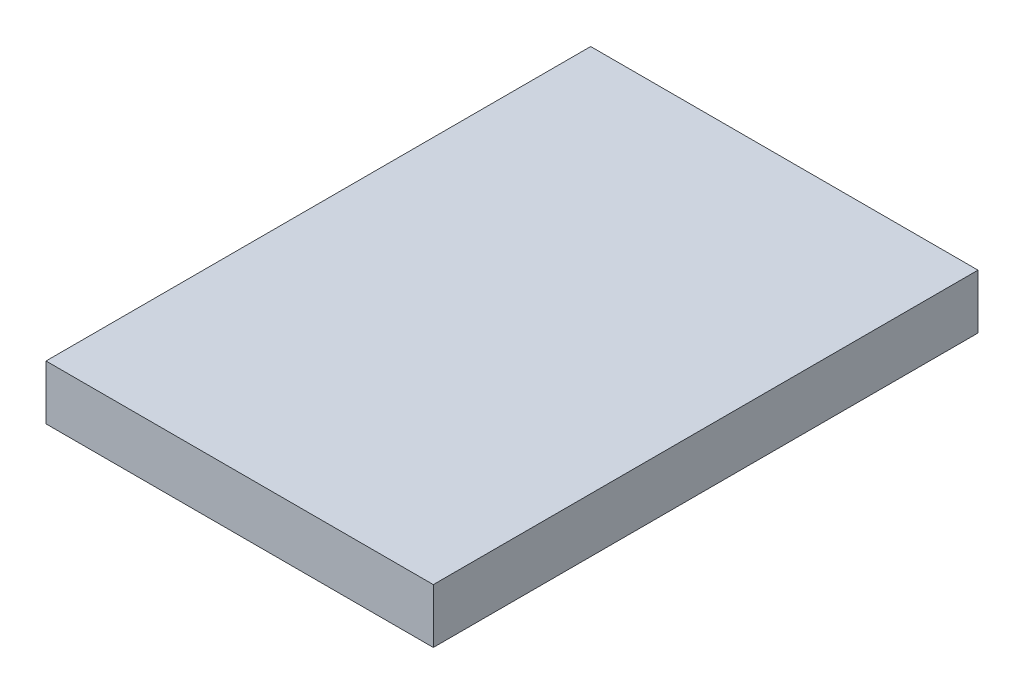
ISO-10303-21;
HEADER;
FILE_DESCRIPTION(('STEP AP214'),'2;1');
FILE_NAME('part.step','',(''),(''),'','','');
FILE_SCHEMA(('AUTOMOTIVE_DESIGN { 1 0 10303 214 1 1 1 1 }'));
ENDSEC;
DATA;
#1=APPLICATION_CONTEXT('core data for automotive mechanical design processes');
#2=APPLICATION_PROTOCOL_DEFINITION('international standard','automotive_design',2000,#1);
#3=PRODUCT_CONTEXT('',#1,'mechanical');
#4=PRODUCT('Part','Part','',(#3));
#5=PRODUCT_RELATED_PRODUCT_CATEGORY('part','',(#4));
#6=PRODUCT_DEFINITION_FORMATION('','',#4);
#7=PRODUCT_DEFINITION_CONTEXT('part definition',#1,'design');
#8=PRODUCT_DEFINITION('design','',#6,#7);
#9=PRODUCT_DEFINITION_SHAPE('','',#8);
#10=(LENGTH_UNIT() NAMED_UNIT(*) SI_UNIT(.MILLI.,.METRE.));
#11=(NAMED_UNIT(*) PLANE_ANGLE_UNIT() SI_UNIT($,.RADIAN.));
#12=(NAMED_UNIT(*) SI_UNIT($,.STERADIAN.) SOLID_ANGLE_UNIT());
#13=UNCERTAINTY_MEASURE_WITH_UNIT(LENGTH_MEASURE(1.E-05),#10,'distance_accuracy_value','');
#14=(GEOMETRIC_REPRESENTATION_CONTEXT(3) GLOBAL_UNCERTAINTY_ASSIGNED_CONTEXT((#13)) GLOBAL_UNIT_ASSIGNED_CONTEXT((#10,
#11,#12)) REPRESENTATION_CONTEXT('',''));
#15=CARTESIAN_POINT('',(0.,0.,0.));
#16=DIRECTION('',(0.,0.,1.));
#17=DIRECTION('',(1.,0.,0.));
#18=AXIS2_PLACEMENT_3D('',#15,#16,#17);
#19=CARTESIAN_POINT('',(3.2,0.45,0.));
#20=DIRECTION('',(0.,0.,-1.));
#21=DIRECTION('',(-1.,0.,0.));
#22=AXIS2_PLACEMENT_3D('',#19,#20,#21);
#23=PLANE('',#22);
#24=DIRECTION('',(1.,0.,0.));
#25=VECTOR('',#24,1.);
#26=CARTESIAN_POINT('',(3.2,0.,0.));
#27=LINE('',#26,#25);
#28=CARTESIAN_POINT('',(0.,0.,0.));
#29=VERTEX_POINT('',#28);
#30=CARTESIAN_POINT('',(3.2,0.,0.));
#31=VERTEX_POINT('',#30);
#32=EDGE_CURVE('E97',#29,#31,#27,.T.);
#33=ORIENTED_EDGE('',*,*,#32,.T.);
#34=DIRECTION('',(0.,-1.,0.));
#35=VECTOR('',#34,1.);
#36=CARTESIAN_POINT('',(3.2,0.45,0.));
#37=LINE('',#36,#35);
#38=CARTESIAN_POINT('',(3.2,0.45,0.));
#39=VERTEX_POINT('',#38);
#40=EDGE_CURVE('E11',#39,#31,#37,.T.);
#41=ORIENTED_EDGE('',*,*,#40,.F.);
#42=DIRECTION('',(1.,0.,0.));
#43=VECTOR('',#42,1.);
#44=CARTESIAN_POINT('',(3.2,0.45,0.));
#45=LINE('',#44,#43);
#46=CARTESIAN_POINT('',(0.,0.45,0.));
#47=VERTEX_POINT('',#46);
#48=EDGE_CURVE('E85',#47,#39,#45,.T.);
#49=ORIENTED_EDGE('',*,*,#48,.F.);
#50=DIRECTION('',(0.,-1.,0.));
#51=VECTOR('',#50,1.);
#52=CARTESIAN_POINT('',(0.,0.45,0.));
#53=LINE('',#52,#51);
#54=EDGE_CURVE('E93',#47,#29,#53,.T.);
#55=ORIENTED_EDGE('',*,*,#54,.T.);
#56=EDGE_LOOP('',(#33,#41,#49,#55));
#57=FACE_BOUND('',#56,.T.);
#58=ADVANCED_FACE('F34',(#57),#23,.F.);
#59=CARTESIAN_POINT('',(3.2,0.45,-4.5));
#60=DIRECTION('',(-1.,0.,0.));
#61=DIRECTION('',(0.,0.,1.));
#62=AXIS2_PLACEMENT_3D('',#59,#60,#61);
#63=PLANE('',#62);
#64=DIRECTION('',(0.,0.,-1.));
#65=VECTOR('',#64,1.);
#66=CARTESIAN_POINT('',(3.2,0.,-4.5));
#67=LINE('',#66,#65);
#68=CARTESIAN_POINT('',(3.2,0.,-4.5));
#69=VERTEX_POINT('',#68);
#70=EDGE_CURVE('E89',#31,#69,#67,.T.);
#71=ORIENTED_EDGE('',*,*,#70,.T.);
#72=DIRECTION('',(0.,-1.,0.));
#73=VECTOR('',#72,1.);
#74=CARTESIAN_POINT('',(3.2,0.45,-4.5));
#75=LINE('',#74,#73);
#76=CARTESIAN_POINT('',(3.2,0.45,-4.5));
#77=VERTEX_POINT('',#76);
#78=EDGE_CURVE('E42',#77,#69,#75,.T.);
#79=ORIENTED_EDGE('',*,*,#78,.F.);
#80=DIRECTION('',(0.,0.,-1.));
#81=VECTOR('',#80,1.);
#82=CARTESIAN_POINT('',(3.2,0.45,-4.5));
#83=LINE('',#82,#81);
#84=EDGE_CURVE('E80',#39,#77,#83,.T.);
#85=ORIENTED_EDGE('',*,*,#84,.F.);
#86=ORIENTED_EDGE('',*,*,#40,.T.);
#87=EDGE_LOOP('',(#71,#79,#85,#86));
#88=FACE_BOUND('',#87,.T.);
#89=ADVANCED_FACE('F88',(#88),#63,.F.);
#90=CARTESIAN_POINT('',(0.,0.45,-4.5));
#91=DIRECTION('',(0.,0.,1.));
#92=DIRECTION('',(1.,0.,0.));
#93=AXIS2_PLACEMENT_3D('',#90,#91,#92);
#94=PLANE('',#93);
#95=DIRECTION('',(-1.,0.,0.));
#96=VECTOR('',#95,1.);
#97=CARTESIAN_POINT('',(0.,0.,-4.5));
#98=LINE('',#97,#96);
#99=CARTESIAN_POINT('',(0.,0.,-4.5));
#100=VERTEX_POINT('',#99);
#101=EDGE_CURVE('E67',#69,#100,#98,.T.);
#102=ORIENTED_EDGE('',*,*,#101,.T.);
#103=DIRECTION('',(0.,-1.,0.));
#104=VECTOR('',#103,1.);
#105=CARTESIAN_POINT('',(0.,0.45,-4.5));
#106=LINE('',#105,#104);
#107=CARTESIAN_POINT('',(0.,0.45,-4.5));
#108=VERTEX_POINT('',#107);
#109=EDGE_CURVE('E90',#108,#100,#106,.T.);
#110=ORIENTED_EDGE('',*,*,#109,.F.);
#111=DIRECTION('',(-1.,0.,0.));
#112=VECTOR('',#111,1.);
#113=CARTESIAN_POINT('',(0.,0.45,-4.5));
#114=LINE('',#113,#112);
#115=EDGE_CURVE('E83',#77,#108,#114,.T.);
#116=ORIENTED_EDGE('',*,*,#115,.F.);
#117=ORIENTED_EDGE('',*,*,#78,.T.);
#118=EDGE_LOOP('',(#102,#110,#116,#117));
#119=FACE_BOUND('',#118,.T.);
#120=ADVANCED_FACE('F91',(#119),#94,.F.);
#121=CARTESIAN_POINT('',(0.,0.45,0.));
#122=DIRECTION('',(1.,0.,0.));
#123=DIRECTION('',(0.,0.,-1.));
#124=AXIS2_PLACEMENT_3D('',#121,#122,#123);
#125=PLANE('',#124);
#126=DIRECTION('',(0.,0.,1.));
#127=VECTOR('',#126,1.);
#128=CARTESIAN_POINT('',(0.,0.,0.));
#129=LINE('',#128,#127);
#130=EDGE_CURVE('E73',#100,#29,#129,.T.);
#131=ORIENTED_EDGE('',*,*,#130,.T.);
#132=ORIENTED_EDGE('',*,*,#54,.F.);
#133=DIRECTION('',(0.,0.,1.));
#134=VECTOR('',#133,1.);
#135=CARTESIAN_POINT('',(0.,0.45,0.));
#136=LINE('',#135,#134);
#137=EDGE_CURVE('E50',#108,#47,#136,.T.);
#138=ORIENTED_EDGE('',*,*,#137,.F.);
#139=ORIENTED_EDGE('',*,*,#109,.T.);
#140=EDGE_LOOP('',(#131,#132,#138,#139));
#141=FACE_BOUND('',#140,.T.);
#142=ADVANCED_FACE('F104',(#141),#125,.F.);
#143=CARTESIAN_POINT('',(0.,0.45,0.));
#144=DIRECTION('',(0.,-1.,0.));
#145=DIRECTION('',(0.,0.,-1.));
#146=AXIS2_PLACEMENT_3D('',#143,#144,#145);
#147=PLANE('',#146);
#148=ORIENTED_EDGE('',*,*,#48,.T.);
#149=ORIENTED_EDGE('',*,*,#84,.T.);
#150=ORIENTED_EDGE('',*,*,#115,.T.);
#151=ORIENTED_EDGE('',*,*,#137,.T.);
#152=EDGE_LOOP('',(#148,#149,#150,#151));
#153=FACE_BOUND('',#152,.T.);
#154=ADVANCED_FACE('F81',(#153),#147,.F.);
#155=CARTESIAN_POINT('',(0.,0.,0.));
#156=DIRECTION('',(0.,-1.,0.));
#157=DIRECTION('',(0.,0.,-1.));
#158=AXIS2_PLACEMENT_3D('',#155,#156,#157);
#159=PLANE('',#158);
#160=ORIENTED_EDGE('',*,*,#32,.F.);
#161=ORIENTED_EDGE('',*,*,#130,.F.);
#162=ORIENTED_EDGE('',*,*,#101,.F.);
#163=ORIENTED_EDGE('',*,*,#70,.F.);
#164=EDGE_LOOP('',(#160,#161,#162,#163));
#165=FACE_BOUND('',#164,.T.);
#166=ADVANCED_FACE('F107',(#165),#159,.T.);
#167=CLOSED_SHELL('',(#58,#89,#120,#142,#154,#166));
#168=MANIFOLD_SOLID_BREP('B2',#167);
#169=ADVANCED_BREP_SHAPE_REPRESENTATION('',(#18,#168),#14);
#170=SHAPE_DEFINITION_REPRESENTATION(#9,#169);
ENDSEC;
END-ISO-10303-21;
